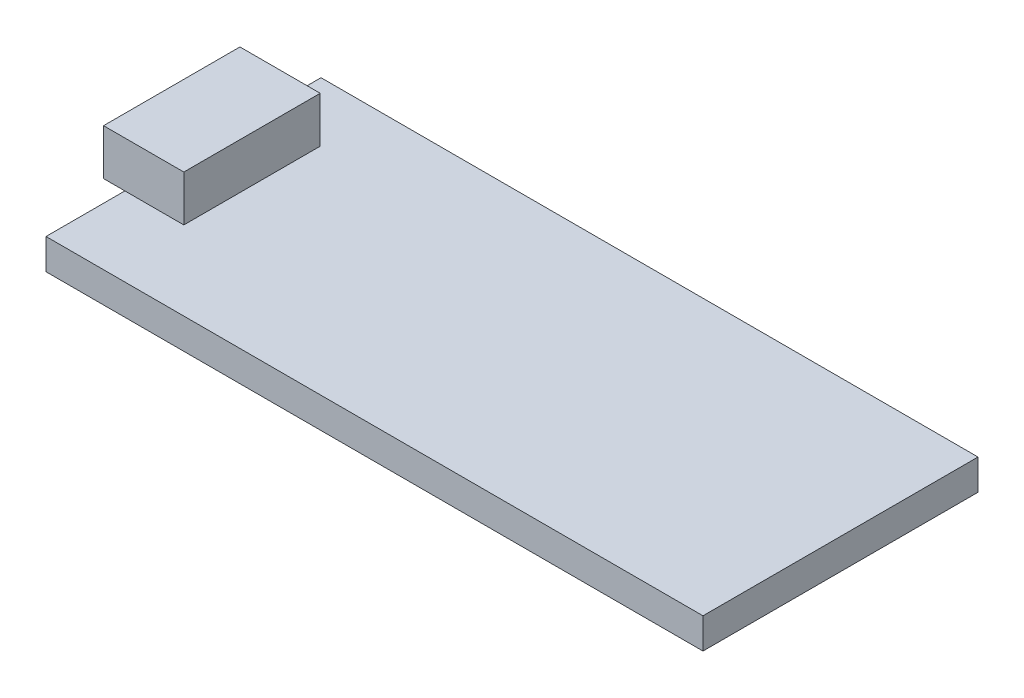
ISO-10303-21;
HEADER;
FILE_DESCRIPTION(('STEP AP214'),'2;1');
FILE_NAME('part.step','',(''),(''),'','','');
FILE_SCHEMA(('AUTOMOTIVE_DESIGN { 1 0 10303 214 1 1 1 1 }'));
ENDSEC;
DATA;
#1=APPLICATION_CONTEXT('core data for automotive mechanical design processes');
#2=APPLICATION_PROTOCOL_DEFINITION('international standard','automotive_design',2000,#1);
#3=PRODUCT_CONTEXT('',#1,'mechanical');
#4=PRODUCT('Part','Part','',(#3));
#5=PRODUCT_RELATED_PRODUCT_CATEGORY('part','',(#4));
#6=PRODUCT_DEFINITION_FORMATION('','',#4);
#7=PRODUCT_DEFINITION_CONTEXT('part definition',#1,'design');
#8=PRODUCT_DEFINITION('design','',#6,#7);
#9=PRODUCT_DEFINITION_SHAPE('','',#8);
#10=(LENGTH_UNIT() NAMED_UNIT(*) SI_UNIT(.MILLI.,.METRE.));
#11=(NAMED_UNIT(*) PLANE_ANGLE_UNIT() SI_UNIT($,.RADIAN.));
#12=(NAMED_UNIT(*) SI_UNIT($,.STERADIAN.) SOLID_ANGLE_UNIT());
#13=UNCERTAINTY_MEASURE_WITH_UNIT(LENGTH_MEASURE(1.E-05),#10,'distance_accuracy_value','');
#14=(GEOMETRIC_REPRESENTATION_CONTEXT(3) GLOBAL_UNCERTAINTY_ASSIGNED_CONTEXT((#13)) GLOBAL_UNIT_ASSIGNED_CONTEXT((#10,
#11,#12)) REPRESENTATION_CONTEXT('',''));
#15=CARTESIAN_POINT('',(0.,0.,0.));
#16=DIRECTION('',(0.,0.,1.));
#17=DIRECTION('',(1.,0.,0.));
#18=AXIS2_PLACEMENT_3D('',#15,#16,#17);
#19=CARTESIAN_POINT('',(0.,2.,0.));
#20=DIRECTION('',(1.,0.,0.));
#21=DIRECTION('',(0.,0.,-1.));
#22=AXIS2_PLACEMENT_3D('',#19,#20,#21);
#23=PLANE('',#22);
#24=DIRECTION('',(0.,0.,1.));
#25=VECTOR('',#24,1.);
#26=CARTESIAN_POINT('',(0.,0.,0.));
#27=LINE('',#26,#25);
#28=CARTESIAN_POINT('',(0.,0.,0.));
#29=VERTEX_POINT('',#28);
#30=CARTESIAN_POINT('',(0.,0.,18.));
#31=VERTEX_POINT('',#30);
#32=EDGE_CURVE('E128',#29,#31,#27,.T.);
#33=ORIENTED_EDGE('',*,*,#32,.T.);
#34=DIRECTION('',(0.,-1.,0.));
#35=VECTOR('',#34,1.);
#36=CARTESIAN_POINT('',(0.,2.,18.));
#37=LINE('',#36,#35);
#38=CARTESIAN_POINT('',(0.,2.,18.));
#39=VERTEX_POINT('',#38);
#40=EDGE_CURVE('E36',#39,#31,#37,.T.);
#41=ORIENTED_EDGE('',*,*,#40,.F.);
#42=DIRECTION('',(0.,0.,1.));
#43=VECTOR('',#42,1.);
#44=CARTESIAN_POINT('',(0.,2.,0.));
#45=LINE('',#44,#43);
#46=CARTESIAN_POINT('',(0.,2.,12.8361357875055));
#47=VERTEX_POINT('',#46);
#48=EDGE_CURVE('E141',#47,#39,#45,.T.);
#49=ORIENTED_EDGE('',*,*,#48,.F.);
#50=CARTESIAN_POINT('',(0.,2.,3.91002994731756));
#51=VERTEX_POINT('',#50);
#52=EDGE_CURVE('E140',#51,#47,#45,.T.);
#53=ORIENTED_EDGE('',*,*,#52,.F.);
#54=CARTESIAN_POINT('',(0.,2.,0.));
#55=VERTEX_POINT('',#54);
#56=EDGE_CURVE('E137',#55,#51,#45,.T.);
#57=ORIENTED_EDGE('',*,*,#56,.F.);
#58=DIRECTION('',(0.,-1.,0.));
#59=VECTOR('',#58,1.);
#60=CARTESIAN_POINT('',(0.,2.,0.));
#61=LINE('',#60,#59);
#62=EDGE_CURVE('E146',#55,#29,#61,.T.);
#63=ORIENTED_EDGE('',*,*,#62,.T.);
#64=EDGE_LOOP('',(#33,#41,#49,#53,#57,#63));
#65=FACE_BOUND('',#64,.T.);
#66=ADVANCED_FACE('F33',(#65),#23,.F.);
#67=CARTESIAN_POINT('',(0.,2.,18.));
#68=DIRECTION('',(0.,0.,-1.));
#69=DIRECTION('',(-1.,0.,0.));
#70=AXIS2_PLACEMENT_3D('',#67,#68,#69);
#71=PLANE('',#70);
#72=DIRECTION('',(1.,0.,0.));
#73=VECTOR('',#72,1.);
#74=CARTESIAN_POINT('',(0.,0.,18.));
#75=LINE('',#74,#73);
#76=CARTESIAN_POINT('',(43.,0.,18.));
#77=VERTEX_POINT('',#76);
#78=EDGE_CURVE('E131',#31,#77,#75,.T.);
#79=ORIENTED_EDGE('',*,*,#78,.T.);
#80=DIRECTION('',(0.,-1.,0.));
#81=VECTOR('',#80,1.);
#82=CARTESIAN_POINT('',(43.,2.,18.));
#83=LINE('',#82,#81);
#84=CARTESIAN_POINT('',(43.,2.,18.));
#85=VERTEX_POINT('',#84);
#86=EDGE_CURVE('E157',#85,#77,#83,.T.);
#87=ORIENTED_EDGE('',*,*,#86,.F.);
#88=DIRECTION('',(1.,0.,0.));
#89=VECTOR('',#88,1.);
#90=CARTESIAN_POINT('',(0.,2.,18.));
#91=LINE('',#90,#89);
#92=EDGE_CURVE('E139',#39,#85,#91,.T.);
#93=ORIENTED_EDGE('',*,*,#92,.F.);
#94=ORIENTED_EDGE('',*,*,#40,.T.);
#95=EDGE_LOOP('',(#79,#87,#93,#94));
#96=FACE_BOUND('',#95,.T.);
#97=ADVANCED_FACE('F167',(#96),#71,.F.);
#98=CARTESIAN_POINT('',(43.,2.,0.));
#99=DIRECTION('',(-1.,0.,0.));
#100=DIRECTION('',(0.,0.,1.));
#101=AXIS2_PLACEMENT_3D('',#98,#99,#100);
#102=PLANE('',#101);
#103=DIRECTION('',(0.,0.,-1.));
#104=VECTOR('',#103,1.);
#105=CARTESIAN_POINT('',(43.,0.,0.));
#106=LINE('',#105,#104);
#107=CARTESIAN_POINT('',(43.,0.,0.));
#108=VERTEX_POINT('',#107);
#109=EDGE_CURVE('E149',#77,#108,#106,.T.);
#110=ORIENTED_EDGE('',*,*,#109,.T.);
#111=DIRECTION('',(0.,-1.,0.));
#112=VECTOR('',#111,1.);
#113=CARTESIAN_POINT('',(43.,2.,0.));
#114=LINE('',#113,#112);
#115=CARTESIAN_POINT('',(43.,2.,0.));
#116=VERTEX_POINT('',#115);
#117=EDGE_CURVE('E155',#116,#108,#114,.T.);
#118=ORIENTED_EDGE('',*,*,#117,.F.);
#119=DIRECTION('',(0.,0.,-1.));
#120=VECTOR('',#119,1.);
#121=CARTESIAN_POINT('',(43.,2.,0.));
#122=LINE('',#121,#120);
#123=EDGE_CURVE('E143',#85,#116,#122,.T.);
#124=ORIENTED_EDGE('',*,*,#123,.F.);
#125=ORIENTED_EDGE('',*,*,#86,.T.);
#126=EDGE_LOOP('',(#110,#118,#124,#125));
#127=FACE_BOUND('',#126,.T.);
#128=ADVANCED_FACE('F176',(#127),#102,.F.);
#129=CARTESIAN_POINT('',(0.,2.,0.));
#130=DIRECTION('',(0.,0.,1.));
#131=DIRECTION('',(1.,0.,0.));
#132=AXIS2_PLACEMENT_3D('',#129,#130,#131);
#133=PLANE('',#132);
#134=DIRECTION('',(-1.,0.,0.));
#135=VECTOR('',#134,1.);
#136=CARTESIAN_POINT('',(0.,0.,0.));
#137=LINE('',#136,#135);
#138=EDGE_CURVE('E151',#108,#29,#137,.T.);
#139=ORIENTED_EDGE('',*,*,#138,.T.);
#140=ORIENTED_EDGE('',*,*,#62,.F.);
#141=DIRECTION('',(-1.,0.,0.));
#142=VECTOR('',#141,1.);
#143=CARTESIAN_POINT('',(0.,2.,0.));
#144=LINE('',#143,#142);
#145=EDGE_CURVE('E145',#116,#55,#144,.T.);
#146=ORIENTED_EDGE('',*,*,#145,.F.);
#147=ORIENTED_EDGE('',*,*,#117,.T.);
#148=EDGE_LOOP('',(#139,#140,#146,#147));
#149=FACE_BOUND('',#148,.T.);
#150=ADVANCED_FACE('F179',(#149),#133,.F.);
#151=CARTESIAN_POINT('',(0.,2.,0.));
#152=DIRECTION('',(0.,1.,0.));
#153=DIRECTION('',(0.,0.,1.));
#154=AXIS2_PLACEMENT_3D('',#151,#152,#153);
#155=PLANE('',#154);
#156=DIRECTION('',(-1.,0.,0.));
#157=VECTOR('',#156,1.);
#158=CARTESIAN_POINT('',(-1.39740193787346,2.,3.91002994731756));
#159=LINE('',#158,#157);
#160=CARTESIAN_POINT('',(3.85676069715356,2.,3.91002994731756));
#161=VERTEX_POINT('',#160);
#162=EDGE_CURVE('E49',#161,#51,#159,.T.);
#163=ORIENTED_EDGE('',*,*,#162,.F.);
#164=DIRECTION('',(0.,0.,-1.));
#165=VECTOR('',#164,1.);
#166=CARTESIAN_POINT('',(3.85676069715356,2.,3.91002994731756));
#167=LINE('',#166,#165);
#168=CARTESIAN_POINT('',(3.85676069715356,2.,12.8361357875055));
#169=VERTEX_POINT('',#168);
#170=EDGE_CURVE('E186',#169,#161,#167,.T.);
#171=ORIENTED_EDGE('',*,*,#170,.F.);
#172=DIRECTION('',(1.,0.,0.));
#173=VECTOR('',#172,1.);
#174=CARTESIAN_POINT('',(-1.39740193787346,2.,12.8361357875055));
#175=LINE('',#174,#173);
#176=EDGE_CURVE('E11',#47,#169,#175,.T.);
#177=ORIENTED_EDGE('',*,*,#176,.F.);
#178=ORIENTED_EDGE('',*,*,#48,.T.);
#179=ORIENTED_EDGE('',*,*,#92,.T.);
#180=ORIENTED_EDGE('',*,*,#123,.T.);
#181=ORIENTED_EDGE('',*,*,#145,.T.);
#182=ORIENTED_EDGE('',*,*,#56,.T.);
#183=EDGE_LOOP('',(#163,#171,#177,#178,#179,#180,#181,#182));
#184=FACE_BOUND('',#183,.T.);
#185=ADVANCED_FACE('F180',(#184),#155,.T.);
#186=CARTESIAN_POINT('',(0.,0.,0.));
#187=DIRECTION('',(0.,1.,0.));
#188=DIRECTION('',(0.,0.,1.));
#189=AXIS2_PLACEMENT_3D('',#186,#187,#188);
#190=PLANE('',#189);
#191=ORIENTED_EDGE('',*,*,#32,.F.);
#192=ORIENTED_EDGE('',*,*,#138,.F.);
#193=ORIENTED_EDGE('',*,*,#109,.F.);
#194=ORIENTED_EDGE('',*,*,#78,.F.);
#195=EDGE_LOOP('',(#191,#192,#193,#194));
#196=FACE_BOUND('',#195,.T.);
#197=ADVANCED_FACE('F174',(#196),#190,.F.);
#198=CARTESIAN_POINT('',(0.,2.,0.));
#199=DIRECTION('',(0.,1.,0.));
#200=DIRECTION('',(0.,0.,1.));
#201=AXIS2_PLACEMENT_3D('',#198,#199,#200);
#202=PLANE('',#201);
#203=CARTESIAN_POINT('',(-1.39740193787346,2.,3.91002994731756));
#204=VERTEX_POINT('',#203);
#205=EDGE_CURVE('E185',#51,#204,#159,.T.);
#206=ORIENTED_EDGE('',*,*,#205,.F.);
#207=ORIENTED_EDGE('',*,*,#52,.T.);
#208=CARTESIAN_POINT('',(-1.39740193787346,2.,12.8361357875055));
#209=VERTEX_POINT('',#208);
#210=EDGE_CURVE('E42',#209,#47,#175,.T.);
#211=ORIENTED_EDGE('',*,*,#210,.F.);
#212=DIRECTION('',(0.,0.,1.));
#213=VECTOR('',#212,1.);
#214=CARTESIAN_POINT('',(-1.39740193787346,2.,3.91002994731756));
#215=LINE('',#214,#213);
#216=EDGE_CURVE('E127',#204,#209,#215,.T.);
#217=ORIENTED_EDGE('',*,*,#216,.F.);
#218=EDGE_LOOP('',(#206,#207,#211,#217));
#219=FACE_BOUND('',#218,.T.);
#220=ADVANCED_FACE('F184',(#219),#202,.F.);
#221=CARTESIAN_POINT('',(-1.39740193787346,5.,3.91002994731756));
#222=DIRECTION('',(1.,0.,0.));
#223=DIRECTION('',(0.,0.,-1.));
#224=AXIS2_PLACEMENT_3D('',#221,#222,#223);
#225=PLANE('',#224);
#226=ORIENTED_EDGE('',*,*,#216,.T.);
#227=DIRECTION('',(0.,-1.,0.));
#228=VECTOR('',#227,1.);
#229=CARTESIAN_POINT('',(-1.39740193787346,5.,12.8361357875055));
#230=LINE('',#229,#228);
#231=CARTESIAN_POINT('',(-1.39740193787346,5.,12.8361357875055));
#232=VERTEX_POINT('',#231);
#233=EDGE_CURVE('E108',#232,#209,#230,.T.);
#234=ORIENTED_EDGE('',*,*,#233,.F.);
#235=DIRECTION('',(0.,0.,1.));
#236=VECTOR('',#235,1.);
#237=CARTESIAN_POINT('',(-1.39740193787346,5.,3.91002994731756));
#238=LINE('',#237,#236);
#239=CARTESIAN_POINT('',(-1.39740193787346,5.,3.91002994731756));
#240=VERTEX_POINT('',#239);
#241=EDGE_CURVE('E115',#240,#232,#238,.T.);
#242=ORIENTED_EDGE('',*,*,#241,.F.);
#243=DIRECTION('',(0.,-1.,0.));
#244=VECTOR('',#243,1.);
#245=CARTESIAN_POINT('',(-1.39740193787346,5.,3.91002994731756));
#246=LINE('',#245,#244);
#247=EDGE_CURVE('E192',#240,#204,#246,.T.);
#248=ORIENTED_EDGE('',*,*,#247,.T.);
#249=EDGE_LOOP('',(#226,#234,#242,#248));
#250=FACE_BOUND('',#249,.T.);
#251=ADVANCED_FACE('F125',(#250),#225,.F.);
#252=CARTESIAN_POINT('',(-1.39740193787346,5.,12.8361357875055));
#253=DIRECTION('',(0.,0.,-1.));
#254=DIRECTION('',(-1.,0.,0.));
#255=AXIS2_PLACEMENT_3D('',#252,#253,#254);
#256=PLANE('',#255);
#257=ORIENTED_EDGE('',*,*,#210,.T.);
#258=ORIENTED_EDGE('',*,*,#176,.T.);
#259=DIRECTION('',(0.,-1.,0.));
#260=VECTOR('',#259,1.);
#261=CARTESIAN_POINT('',(3.85676069715356,5.,12.8361357875055));
#262=LINE('',#261,#260);
#263=CARTESIAN_POINT('',(3.85676069715356,5.,12.8361357875055));
#264=VERTEX_POINT('',#263);
#265=EDGE_CURVE('E111',#264,#169,#262,.T.);
#266=ORIENTED_EDGE('',*,*,#265,.F.);
#267=DIRECTION('',(1.,0.,0.));
#268=VECTOR('',#267,1.);
#269=CARTESIAN_POINT('',(-1.39740193787346,5.,12.8361357875055));
#270=LINE('',#269,#268);
#271=EDGE_CURVE('E103',#232,#264,#270,.T.);
#272=ORIENTED_EDGE('',*,*,#271,.F.);
#273=ORIENTED_EDGE('',*,*,#233,.T.);
#274=EDGE_LOOP('',(#257,#258,#266,#272,#273));
#275=FACE_BOUND('',#274,.T.);
#276=ADVANCED_FACE('F106',(#275),#256,.F.);
#277=CARTESIAN_POINT('',(3.85676069715356,5.,3.91002994731756));
#278=DIRECTION('',(-1.,0.,0.));
#279=DIRECTION('',(0.,0.,1.));
#280=AXIS2_PLACEMENT_3D('',#277,#278,#279);
#281=PLANE('',#280);
#282=ORIENTED_EDGE('',*,*,#170,.T.);
#283=DIRECTION('',(0.,-1.,0.));
#284=VECTOR('',#283,1.);
#285=CARTESIAN_POINT('',(3.85676069715356,5.,3.91002994731756));
#286=LINE('',#285,#284);
#287=CARTESIAN_POINT('',(3.85676069715356,5.,3.91002994731756));
#288=VERTEX_POINT('',#287);
#289=EDGE_CURVE('E133',#288,#161,#286,.T.);
#290=ORIENTED_EDGE('',*,*,#289,.F.);
#291=DIRECTION('',(0.,0.,-1.));
#292=VECTOR('',#291,1.);
#293=CARTESIAN_POINT('',(3.85676069715356,5.,3.91002994731756));
#294=LINE('',#293,#292);
#295=EDGE_CURVE('E114',#264,#288,#294,.T.);
#296=ORIENTED_EDGE('',*,*,#295,.F.);
#297=ORIENTED_EDGE('',*,*,#265,.T.);
#298=EDGE_LOOP('',(#282,#290,#296,#297));
#299=FACE_BOUND('',#298,.T.);
#300=ADVANCED_FACE('F198',(#299),#281,.F.);
#301=CARTESIAN_POINT('',(-1.39740193787346,5.,3.91002994731756));
#302=DIRECTION('',(0.,0.,1.));
#303=DIRECTION('',(1.,0.,0.));
#304=AXIS2_PLACEMENT_3D('',#301,#302,#303);
#305=PLANE('',#304);
#306=ORIENTED_EDGE('',*,*,#162,.T.);
#307=ORIENTED_EDGE('',*,*,#205,.T.);
#308=ORIENTED_EDGE('',*,*,#247,.F.);
#309=DIRECTION('',(-1.,0.,0.));
#310=VECTOR('',#309,1.);
#311=CARTESIAN_POINT('',(-1.39740193787346,5.,3.91002994731756));
#312=LINE('',#311,#310);
#313=EDGE_CURVE('E120',#288,#240,#312,.T.);
#314=ORIENTED_EDGE('',*,*,#313,.F.);
#315=ORIENTED_EDGE('',*,*,#289,.T.);
#316=EDGE_LOOP('',(#306,#307,#308,#314,#315));
#317=FACE_BOUND('',#316,.T.);
#318=ADVANCED_FACE('F196',(#317),#305,.F.);
#319=CARTESIAN_POINT('',(0.,5.,0.));
#320=DIRECTION('',(0.,1.,0.));
#321=DIRECTION('',(0.,0.,1.));
#322=AXIS2_PLACEMENT_3D('',#319,#320,#321);
#323=PLANE('',#322);
#324=ORIENTED_EDGE('',*,*,#241,.T.);
#325=ORIENTED_EDGE('',*,*,#271,.T.);
#326=ORIENTED_EDGE('',*,*,#295,.T.);
#327=ORIENTED_EDGE('',*,*,#313,.T.);
#328=EDGE_LOOP('',(#324,#325,#326,#327));
#329=FACE_BOUND('',#328,.T.);
#330=ADVANCED_FACE('F118',(#329),#323,.T.);
#331=CLOSED_SHELL('',(#66,#97,#128,#150,#185,#197,#220,#251,#276,#300,#318,#330));
#332=MANIFOLD_SOLID_BREP('B2',#331);
#333=ADVANCED_BREP_SHAPE_REPRESENTATION('',(#18,#332),#14);
#334=SHAPE_DEFINITION_REPRESENTATION(#9,#333);
ENDSEC;
END-ISO-10303-21;
